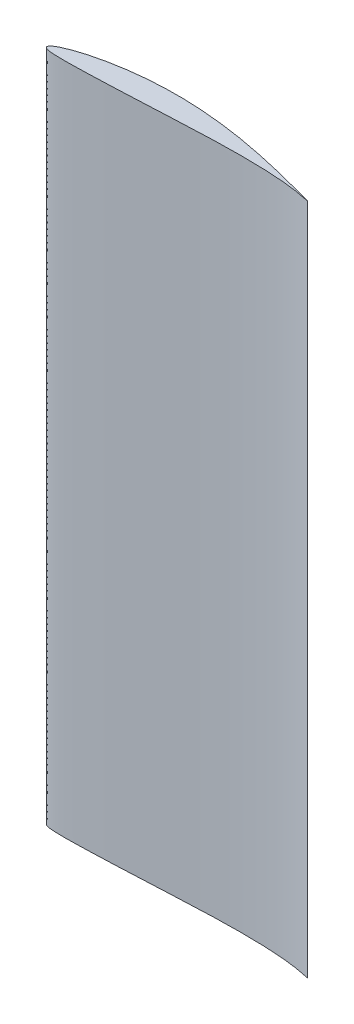
ISO-10303-21;
HEADER;
FILE_DESCRIPTION(('STEP AP214'),'2;1');
FILE_NAME('part.step','',(''),(''),'','','');
FILE_SCHEMA(('AUTOMOTIVE_DESIGN { 1 0 10303 214 1 1 1 1 }'));
ENDSEC;
DATA;
#1=APPLICATION_CONTEXT('core data for automotive mechanical design processes');
#2=APPLICATION_PROTOCOL_DEFINITION('international standard','automotive_design',2000,#1);
#3=PRODUCT_CONTEXT('',#1,'mechanical');
#4=PRODUCT('Part','Part','',(#3));
#5=PRODUCT_RELATED_PRODUCT_CATEGORY('part','',(#4));
#6=PRODUCT_DEFINITION_FORMATION('','',#4);
#7=PRODUCT_DEFINITION_CONTEXT('part definition',#1,'design');
#8=PRODUCT_DEFINITION('design','',#6,#7);
#9=PRODUCT_DEFINITION_SHAPE('','',#8);
#10=(LENGTH_UNIT() NAMED_UNIT(*) SI_UNIT(.MILLI.,.METRE.));
#11=(NAMED_UNIT(*) PLANE_ANGLE_UNIT() SI_UNIT($,.RADIAN.));
#12=(NAMED_UNIT(*) SI_UNIT($,.STERADIAN.) SOLID_ANGLE_UNIT());
#13=UNCERTAINTY_MEASURE_WITH_UNIT(LENGTH_MEASURE(1.E-05),#10,'distance_accuracy_value','');
#14=(GEOMETRIC_REPRESENTATION_CONTEXT(3) GLOBAL_UNCERTAINTY_ASSIGNED_CONTEXT((#13)) GLOBAL_UNIT_ASSIGNED_CONTEXT((#10,
#11,#12)) REPRESENTATION_CONTEXT('',''));
#15=CARTESIAN_POINT('',(0.,0.,0.));
#16=DIRECTION('',(0.,0.,1.));
#17=DIRECTION('',(1.,0.,0.));
#18=AXIS2_PLACEMENT_3D('',#15,#16,#17);
#19=CARTESIAN_POINT('',(-554.325552257857,0.,-56.8646156682797));
#20=DIRECTION('',(0.983760241532051,0.,-0.179487568318255));
#21=DIRECTION('',(-0.179487568318255,0.,-0.983760241532051));
#22=AXIS2_PLACEMENT_3D('',#19,#20,#21);
#23=PLANE('',#22);
#24=DIRECTION('',(0.,-1.,0.));
#25=VECTOR('',#24,1.);
#26=CARTESIAN_POINT('',(-528.575769962789,-239.8004537,84.2683459219282));
#27=LINE('',#26,#25);
#28=CARTESIAN_POINT('',(-528.575769939724,-253.210331383299,84.2683459272844));
#29=VERTEX_POINT('',#28);
#30=CARTESIAN_POINT('',(-528.575769944008,-507.210331383299,84.2683459262897));
#31=VERTEX_POINT('',#30);
#32=EDGE_CURVE('E44',#29,#31,#27,.T.);
#33=ORIENTED_EDGE('',*,*,#32,.T.);
#34=DIRECTION('',(-0.179487614062532,0.,-0.983760233185983));
#35=VECTOR('',#34,1.);
#36=CARTESIAN_POINT('',(-528.591918071853,-507.210331383299,84.1798390613565));
#37=LINE('',#36,#35);
#38=CARTESIAN_POINT('',(-528.591918071128,-507.210331383299,84.1798390653302));
#39=VERTEX_POINT('',#38);
#40=EDGE_CURVE('E69',#31,#39,#37,.T.);
#41=ORIENTED_EDGE('',*,*,#40,.T.);
#42=DIRECTION('',(0.,-1.,0.));
#43=VECTOR('',#42,1.);
#44=CARTESIAN_POINT('',(-528.591918083824,-239.8004537,84.1798390618738));
#45=LINE('',#44,#43);
#46=CARTESIAN_POINT('',(-528.591918062001,-253.210331383299,84.1798390678149));
#47=VERTEX_POINT('',#46);
#48=EDGE_CURVE('E11',#39,#47,#45,.F.);
#49=ORIENTED_EDGE('',*,*,#48,.T.);
#50=DIRECTION('',(0.17948756488624,0.,0.983760242158224));
#51=VECTOR('',#50,1.);
#52=CARTESIAN_POINT('',(-528.575769940641,-253.210331383299,84.2683459222606));
#53=LINE('',#52,#51);
#54=EDGE_CURVE('E68',#47,#29,#53,.T.);
#55=ORIENTED_EDGE('',*,*,#54,.T.);
#56=EDGE_LOOP('',(#33,#41,#49,#55));
#57=FACE_BOUND('',#56,.T.);
#58=ADVANCED_FACE('F34',(#57),#23,.T.);
#59=CARTESIAN_POINT('',(-526.593419765934,-239.8004537,84.7239199130439));
#60=CARTESIAN_POINT('',(-527.259585871897,-239.8004537,84.5425596293205));
#61=CARTESIAN_POINT('',(-527.92575197786,-239.8004537,84.3611993455972));
#62=CARTESIAN_POINT('',(-528.591918083824,-239.8004537,84.1798390618738));
#63=CARTESIAN_POINT('',(-530.497138216162,-239.8004537,83.6611527152356));
#64=CARTESIAN_POINT('',(-534.152374255812,-239.8004537,82.6762330634614));
#65=CARTESIAN_POINT('',(-539.982108342011,-239.8004537,81.1611509221717));
#66=CARTESIAN_POINT('',(-545.957453464546,-239.8004537,79.6969831396235));
#67=CARTESIAN_POINT('',(-551.162022478609,-239.8004537,78.5269223568208));
#68=CARTESIAN_POINT('',(-555.323842405048,-239.8004537,77.672019641801));
#69=CARTESIAN_POINT('',(-558.463490437311,-239.8004537,77.0704112611737));
#70=CARTESIAN_POINT('',(-561.59743117091,-239.8004537,76.5181057779595));
#71=CARTESIAN_POINT('',(-564.824208706987,-239.8004537,76.0021223648773));
#72=CARTESIAN_POINT('',(-568.119644878359,-239.8004537,75.5359523553538));
#73=CARTESIAN_POINT('',(-571.485057233212,-239.8004537,75.1275157973673));
#74=CARTESIAN_POINT('',(-574.868030500645,-239.8004537,74.7910791806653));
#75=CARTESIAN_POINT('',(-578.091795357308,-239.8004537,74.5395167140872));
#76=CARTESIAN_POINT('',(-581.160116557733,-239.8004537,74.3539017800194));
#77=CARTESIAN_POINT('',(-584.038090585231,-239.8004537,74.2365051093385));
#78=CARTESIAN_POINT('',(-586.914428291189,-239.8004537,74.1830869395487));
#79=CARTESIAN_POINT('',(-589.896558655677,-239.8004537,74.1923438209683));
#80=CARTESIAN_POINT('',(-592.983115789962,-239.8004537,74.2735758159778));
#81=CARTESIAN_POINT('',(-596.173451342689,-239.8004537,74.4396005836429));
#82=CARTESIAN_POINT('',(-599.355769517787,-239.8004537,74.6874159477797));
#83=CARTESIAN_POINT('',(-602.53411874826,-239.8004537,75.0169077766059));
#84=CARTESIAN_POINT('',(-605.17250746658,-239.8004537,75.3608845639358));
#85=CARTESIAN_POINT('',(-607.275094484379,-239.8004537,75.6787374805192));
#86=CARTESIAN_POINT('',(-608.844128267428,-239.8004537,75.9383218957363));
#87=CARTESIAN_POINT('',(-610.410125982362,-239.8004537,76.2200005207807));
#88=CARTESIAN_POINT('',(-611.97533572736,-239.8004537,76.525593801417));
#89=CARTESIAN_POINT('',(-613.538215781285,-239.8004537,76.8563798041714));
#90=CARTESIAN_POINT('',(-614.848329170269,-239.8004537,77.1563581609815));
#91=CARTESIAN_POINT('',(-615.918435733108,-239.8004537,77.4169575519566));
#92=CARTESIAN_POINT('',(-616.747067939194,-239.8004537,77.6276299376467));
#93=CARTESIAN_POINT('',(-617.576027468063,-239.8004537,77.8479257179723));
#94=CARTESIAN_POINT('',(-618.392498935893,-239.8004537,78.0747363302009));
#95=CARTESIAN_POINT('',(-619.205560354131,-239.8004537,78.3108188199684));
#96=CARTESIAN_POINT('',(-620.018568231687,-239.8004537,78.5579465251468));
#97=CARTESIAN_POINT('',(-620.835135260398,-239.8004537,78.8183863563189));
#98=CARTESIAN_POINT('',(-621.646830026876,-239.8004537,79.0900082378914));
#99=CARTESIAN_POINT('',(-622.453429478616,-239.8004537,79.3746820906908));
#100=CARTESIAN_POINT('',(-623.24662245888,-239.8004537,79.6727689487293));
#101=CARTESIAN_POINT('',(-624.031597033132,-239.8004537,79.9904026218772));
#102=CARTESIAN_POINT('',(-624.807385625176,-239.8004537,80.3299315239951));
#103=CARTESIAN_POINT('',(-625.460320993749,-239.8004537,80.6371839893424));
#104=CARTESIAN_POINT('',(-625.97600114632,-239.8004537,80.8927546987617));
#105=CARTESIAN_POINT('',(-626.360660841949,-239.8004537,81.091190440915));
#106=CARTESIAN_POINT('',(-626.725483770262,-239.8004537,81.2952421386952));
#107=CARTESIAN_POINT('',(-627.083800697779,-239.8004537,81.5178228833185));
#108=CARTESIAN_POINT('',(-627.427112918002,-239.8004537,81.7619737990763));
#109=CARTESIAN_POINT('',(-627.692990121658,-239.8004537,81.9797142422138));
#110=CARTESIAN_POINT('',(-627.886358398128,-239.8004537,82.1560417964073));
#111=CARTESIAN_POINT('',(-628.011436470284,-239.8004537,82.2908751384918));
#112=CARTESIAN_POINT('',(-628.119597649023,-239.8004537,82.4426834109219));
#113=CARTESIAN_POINT('',(-628.204110478089,-239.8004537,82.6132580652257));
#114=CARTESIAN_POINT('',(-628.259751808724,-239.8004537,82.7947292025837));
#115=CARTESIAN_POINT('',(-628.278589178469,-239.8004537,82.9788856652501));
#116=CARTESIAN_POINT('',(-628.247765545933,-239.8004537,83.1568231089226));
#117=CARTESIAN_POINT('',(-628.154955410665,-239.8004537,83.3092479690364));
#118=CARTESIAN_POINT('',(-628.024383448377,-239.8004537,83.4307744337206));
#119=CARTESIAN_POINT('',(-627.865452945988,-239.8004537,83.5355647646006));
#120=CARTESIAN_POINT('',(-627.696354385194,-239.8004537,83.6216033250483));
#121=CARTESIAN_POINT('',(-627.519605411,-239.8004537,83.6962227929075));
#122=CARTESIAN_POINT('',(-627.353308124164,-239.8004537,83.7544414252507));
#123=CARTESIAN_POINT('',(-627.129623365981,-239.8004537,83.8196992415909));
#124=CARTESIAN_POINT('',(-626.838241327886,-239.8004537,83.8866248908074));
#125=CARTESIAN_POINT('',(-626.48391065014,-239.8004537,83.9480474788163));
#126=CARTESIAN_POINT('',(-626.12047042601,-239.8004537,83.9984758883653));
#127=CARTESIAN_POINT('',(-625.769813360012,-239.8004537,84.0381264987704));
#128=CARTESIAN_POINT('',(-625.41504483594,-239.8004537,84.0705413531205));
#129=CARTESIAN_POINT('',(-625.05528087275,-239.8004537,84.0978236463921));
#130=CARTESIAN_POINT('',(-624.693918003881,-239.8004537,84.1213039879874));
#131=CARTESIAN_POINT('',(-624.331784051651,-239.8004537,84.1416706992703));
#132=CARTESIAN_POINT('',(-623.856159801903,-239.8004537,84.1647415786361));
#133=CARTESIAN_POINT('',(-623.274302103442,-239.8004537,84.1866861864042));
#134=CARTESIAN_POINT('',(-622.577740296122,-239.8004537,84.2052918928147));
#135=CARTESIAN_POINT('',(-621.876656831597,-239.8004537,84.2177202128941));
#136=CARTESIAN_POINT('',(-621.13791086145,-239.8004537,84.2247931924304));
#137=CARTESIAN_POINT('',(-620.40839665173,-239.8004537,84.2264613573671));
#138=CARTESIAN_POINT('',(-619.698179134347,-239.8004537,84.2237213151792));
#139=CARTESIAN_POINT('',(-619.005405670084,-239.8004537,84.2176740611081));
#140=CARTESIAN_POINT('',(-618.252758564704,-239.8004537,84.20800235929));
#141=CARTESIAN_POINT('',(-617.467883394032,-239.8004537,84.1948751875934));
#142=CARTESIAN_POINT('',(-616.433921687155,-239.8004537,84.1741070232226));
#143=CARTESIAN_POINT('',(-615.142982081053,-239.8004537,84.1434590507468));
#144=CARTESIAN_POINT('',(-613.53006742117,-239.8004537,84.0992189587972));
#145=CARTESIAN_POINT('',(-611.888435911326,-239.8004537,84.0492301393403));
#146=CARTESIAN_POINT('',(-610.247930028029,-239.8004537,83.9954407304926));
#147=CARTESIAN_POINT('',(-608.676663506592,-239.8004537,83.940785594189));
#148=CARTESIAN_POINT('',(-607.091848772311,-239.8004537,83.8828023631351));
#149=CARTESIAN_POINT('',(-605.486202295219,-239.8004537,83.8216893753504));
#150=CARTESIAN_POINT('',(-603.850136042464,-239.8004537,83.757431508272));
#151=CARTESIAN_POINT('',(-602.212495016589,-239.8004537,83.6918374700966));
#152=CARTESIAN_POINT('',(-600.609672727076,-239.8004537,83.6264393414571));
#153=CARTESIAN_POINT('',(-599.031142280928,-239.8004537,83.5606843189151));
#154=CARTESIAN_POINT('',(-597.444138588479,-239.8004537,83.4934060650845));
#155=CARTESIAN_POINT('',(-595.324681026734,-239.8004537,83.4013499055013));
#156=CARTESIAN_POINT('',(-592.7462925839,-239.8004537,83.2852253347514));
#157=CARTESIAN_POINT('',(-589.473300422514,-239.8004537,83.1281542870365));
#158=CARTESIAN_POINT('',(-586.042648232423,-239.8004537,82.9582761960707));
#159=CARTESIAN_POINT('',(-582.490586502904,-239.8004537,82.7804369677617));
#160=CARTESIAN_POINT('',(-579.182904017143,-239.8004537,82.6181104834192));
#161=CARTESIAN_POINT('',(-576.155602563079,-239.8004537,82.4762526895564));
#162=CARTESIAN_POINT('',(-573.252760019019,-239.8004537,82.3480656154033));
#163=CARTESIAN_POINT('',(-570.429258729535,-239.8004537,82.2309145877562));
#164=CARTESIAN_POINT('',(-567.459339431622,-239.8004537,82.1313636656623));
#165=CARTESIAN_POINT('',(-564.850547994564,-239.8004537,82.0685637584189));
#166=CARTESIAN_POINT('',(-562.692490355915,-239.8004537,82.0174720350613));
#167=CARTESIAN_POINT('',(-560.554619151564,-239.8004537,81.9674534703154));
#168=CARTESIAN_POINT('',(-557.983569299121,-239.8004537,81.9219521096185));
#169=CARTESIAN_POINT('',(-554.794919072768,-239.8004537,81.9156396553184));
#170=CARTESIAN_POINT('',(-551.610605722812,-239.8004537,81.9488257047568));
#171=CARTESIAN_POINT('',(-548.414463715892,-239.8004537,82.024614191168));
#172=CARTESIAN_POINT('',(-545.228115384306,-239.8004537,82.1538046890369));
#173=CARTESIAN_POINT('',(-541.968572902875,-239.8004537,82.3421818495446));
#174=CARTESIAN_POINT('',(-538.64428134478,-239.8004537,82.6126797603633));
#175=CARTESIAN_POINT('',(-535.252866283238,-239.8004537,83.0153913105818));
#176=CARTESIAN_POINT('',(-531.897478264769,-239.8004537,83.5533883576312));
#177=CARTESIAN_POINT('',(-529.665252248977,-239.8004537,84.0153420380267));
#178=CARTESIAN_POINT('',(-528.575769962789,-239.8004537,84.2683459219282));
#179=CARTESIAN_POINT('',(-527.919682592478,-239.8004537,84.4207051249843));
#180=CARTESIAN_POINT('',(-527.263595222166,-239.8004537,84.5730643280405));
#181=CARTESIAN_POINT('',(-526.607507851856,-239.8004537,84.7254235310966));
#182=(BOUNDED_CURVE() B_SPLINE_CURVE(3,(#59,#60,#61,#62,#63,#64,#65,#66,#67,#68,#69,#70,#71,#72,
#73,#74,#75,#76,#77,#78,#79,#80,#81,#82,#83,#84,#85,#86,#87,#88,#89,#90,#91,#92,#93,#94,#95,#96,
#97,#98,#99,#100,#101,#102,#103,#104,#105,#106,#107,#108,#109,#110,#111,#112,#113,#114,#115,
#116,#117,#118,#119,#120,#121,#122,#123,#124,#125,#126,#127,#128,#129,#130,#131,#132,#133,#134,
#135,#136,#137,#138,#139,#140,#141,#142,#143,#144,#145,#146,#147,#148,#149,#150,#151,#152,#153,
#154,#155,#156,#157,#158,#159,#160,#161,#162,#163,#164,#165,#166,#167,#168,#169,#170,#171,#172,
#173,#174,#175,#176,#177,#178,#179,#180,#181),.UNSPECIFIED.,.F.,
.F.) B_SPLINE_CURVE_WITH_KNOTS((4,3,1,1,1,1,1,1,1,1,1,1,1,1,1,1,1,1,1,1,1,1,1,1,1,1,1,1,1,1,1,1,
1,1,1,1,1,1,1,1,1,1,1,1,1,1,1,1,1,1,1,1,1,1,1,1,1,1,1,1,1,1,1,1,1,1,1,1,1,1,1,1,1,1,1,1,1,1,1,1,
1,1,1,1,1,1,1,1,1,1,1,1,1,1,1,1,1,1,1,1,1,1,1,1,1,1,1,1,1,1,1,1,1,1,1,3,4),(-2.028102131,0.,
5.800326639,11.56708317,17.94238355,24.32803371,27.53215933,30.70773874,33.91000701,37.08447162,
40.50895139,43.8966956,47.25440821,50.70870113,53.59759749,56.47686852,59.35004175,62.22840997,
65.42361909,68.61305581,71.81246022,74.99958755,78.19930814,79.79462809,81.37946996,82.97073005,
84.5683458,86.16406893,87.76353673,88.60062982,89.46848312,90.32872771,91.17402976,92.01085118,
92.86885261,93.72342657,94.58231837,95.43682984,96.28965307,97.12445389,97.9772516,98.83013521,
99.28930627,99.70399764,100.1286373,100.5432242,100.9690963,101.3918568,101.573689,101.7540123,
101.9428712,102.1312819,102.3234027,102.5099534,102.6837085,102.8568762,103.0370367,103.2162328,
103.4267447,103.6056681,103.7916159,103.9550953,104.3045948,104.688086,105.0338202,105.4053535,
105.74679,106.1026115,106.487829,106.8332534,107.1908268,107.9165023,108.5801971,109.2814335,
110.0202634,110.7967311,111.4701767,112.151127,112.8753234,113.7285151,114.5063016,115.978126,
117.6027853,119.3473198,120.9057675,122.5274142,124.0644169,125.6638443,127.3482992,128.9768668,
130.5811748,132.1612244,133.7170165,135.3469141,138.5261993,141.4607499,145.1781208,148.8317471,
152.1312963,155.114057,157.9244682,160.8491443,163.5926218,166.83998,168.6784709,170.0692474,
173.2559492,176.3934516,179.6357028,182.8104371,185.9847036,189.204042,192.6042447,195.9935227,
199.4423974,202.8102131,204.838315231),
.UNSPECIFIED.) CURVE() GEOMETRIC_REPRESENTATION_ITEM() RATIONAL_B_SPLINE_CURVE((1.,1.,1.,1.,1.,
1.,1.,1.,1.,1.,1.,1.,1.,1.,1.,1.,1.,1.,1.,1.,1.,1.,1.,1.,1.,1.,1.,1.,1.,1.,1.,1.,1.,1.,1.,1.,1.,
1.,1.,1.,1.,1.,1.,1.,1.,1.,1.,1.,1.,1.,1.,1.,1.,1.,1.,1.,1.,1.,1.,1.,1.,1.,1.,1.,1.,1.,1.,1.,1.,
1.,1.,1.,1.,1.,1.,1.,1.,1.,1.,1.,1.,1.,1.,1.,1.,1.,1.,1.,1.,1.,1.,1.,1.,1.,1.,1.,1.,1.,1.,1.,1.,
1.,1.,1.,1.,1.,1.,1.,1.,1.,1.,1.,1.,1.,1.,1.,1.,1.,1.,1.,1.,1.,1.)) REPRESENTATION_ITEM(''));
#183=DIRECTION('',(0.,-1.,0.));
#184=VECTOR('',#183,1.);
#185=SURFACE_OF_LINEAR_EXTRUSION('',#182,#184);
#186=ORIENTED_EDGE('',*,*,#32,.F.);
#187=CARTESIAN_POINT('',(-526.593419765934,-253.210331383304,84.7239199130439));
#188=CARTESIAN_POINT('',(-527.259585871897,-253.210331383304,84.5425596293205));
#189=CARTESIAN_POINT('',(-527.92575197786,-253.210331383304,84.3611993455972));
#190=CARTESIAN_POINT('',(-528.591918083824,-253.210331383304,84.1798390618738));
#191=CARTESIAN_POINT('',(-530.497138216162,-253.210331383304,83.6611527152356));
#192=CARTESIAN_POINT('',(-534.152374255812,-253.210331383304,82.6762330634614));
#193=CARTESIAN_POINT('',(-539.982108342011,-253.210331383304,81.1611509221717));
#194=CARTESIAN_POINT('',(-545.957453464546,-253.210331383304,79.6969831396235));
#195=CARTESIAN_POINT('',(-551.162022478609,-253.210331383304,78.5269223568208));
#196=CARTESIAN_POINT('',(-555.323842405048,-253.210331383304,77.672019641801));
#197=CARTESIAN_POINT('',(-558.463490437311,-253.210331383304,77.0704112611737));
#198=CARTESIAN_POINT('',(-561.59743117091,-253.210331383304,76.5181057779595));
#199=CARTESIAN_POINT('',(-564.824208706987,-253.210331383304,76.0021223648773));
#200=CARTESIAN_POINT('',(-568.119644878359,-253.210331383304,75.5359523553538));
#201=CARTESIAN_POINT('',(-571.485057233212,-253.210331383304,75.1275157973673));
#202=CARTESIAN_POINT('',(-574.868030500645,-253.210331383304,74.7910791806653));
#203=CARTESIAN_POINT('',(-578.091795357308,-253.210331383304,74.5395167140872));
#204=CARTESIAN_POINT('',(-581.160116557733,-253.210331383304,74.3539017800194));
#205=CARTESIAN_POINT('',(-584.038090585231,-253.210331383304,74.2365051093385));
#206=CARTESIAN_POINT('',(-586.914428291189,-253.210331383304,74.1830869395487));
#207=CARTESIAN_POINT('',(-589.896558655677,-253.210331383304,74.1923438209683));
#208=CARTESIAN_POINT('',(-592.983115789962,-253.210331383304,74.2735758159778));
#209=CARTESIAN_POINT('',(-596.173451342689,-253.210331383304,74.4396005836429));
#210=CARTESIAN_POINT('',(-599.355769517787,-253.210331383304,74.6874159477797));
#211=CARTESIAN_POINT('',(-602.53411874826,-253.210331383304,75.0169077766059));
#212=CARTESIAN_POINT('',(-605.17250746658,-253.210331383304,75.3608845639358));
#213=CARTESIAN_POINT('',(-607.275094484379,-253.210331383304,75.6787374805192));
#214=CARTESIAN_POINT('',(-608.844128267428,-253.210331383304,75.9383218957363));
#215=CARTESIAN_POINT('',(-610.410125982362,-253.210331383304,76.2200005207807));
#216=CARTESIAN_POINT('',(-611.97533572736,-253.210331383304,76.525593801417));
#217=CARTESIAN_POINT('',(-613.538215781285,-253.210331383304,76.8563798041714));
#218=CARTESIAN_POINT('',(-614.848329170269,-253.210331383304,77.1563581609815));
#219=CARTESIAN_POINT('',(-615.918435733108,-253.210331383304,77.4169575519566));
#220=CARTESIAN_POINT('',(-616.747067939194,-253.210331383304,77.6276299376467));
#221=CARTESIAN_POINT('',(-617.576027468063,-253.210331383304,77.8479257179723));
#222=CARTESIAN_POINT('',(-618.392498935893,-253.210331383304,78.0747363302009));
#223=CARTESIAN_POINT('',(-619.205560354131,-253.210331383304,78.3108188199684));
#224=CARTESIAN_POINT('',(-620.018568231687,-253.210331383304,78.5579465251468));
#225=CARTESIAN_POINT('',(-620.835135260398,-253.210331383304,78.8183863563189));
#226=CARTESIAN_POINT('',(-621.646830026876,-253.210331383304,79.0900082378914));
#227=CARTESIAN_POINT('',(-622.453429478616,-253.210331383304,79.3746820906908));
#228=CARTESIAN_POINT('',(-623.24662245888,-253.210331383304,79.6727689487293));
#229=CARTESIAN_POINT('',(-624.031597033132,-253.210331383304,79.9904026218772));
#230=CARTESIAN_POINT('',(-624.807385625176,-253.210331383304,80.3299315239951));
#231=CARTESIAN_POINT('',(-625.460320993749,-253.210331383304,80.6371839893424));
#232=CARTESIAN_POINT('',(-625.97600114632,-253.210331383304,80.8927546987617));
#233=CARTESIAN_POINT('',(-626.360660841949,-253.210331383304,81.091190440915));
#234=CARTESIAN_POINT('',(-626.725483770262,-253.210331383304,81.2952421386952));
#235=CARTESIAN_POINT('',(-627.083800697779,-253.210331383304,81.5178228833185));
#236=CARTESIAN_POINT('',(-627.427112918002,-253.210331383304,81.7619737990763));
#237=CARTESIAN_POINT('',(-627.692990121658,-253.210331383304,81.9797142422138));
#238=CARTESIAN_POINT('',(-627.886358398128,-253.210331383304,82.1560417964073));
#239=CARTESIAN_POINT('',(-628.011436470284,-253.210331383304,82.2908751384918));
#240=CARTESIAN_POINT('',(-628.119597649023,-253.210331383304,82.4426834109219));
#241=CARTESIAN_POINT('',(-628.204110478089,-253.210331383304,82.6132580652257));
#242=CARTESIAN_POINT('',(-628.259751808724,-253.210331383304,82.7947292025837));
#243=CARTESIAN_POINT('',(-628.278589178469,-253.210331383304,82.9788856652501));
#244=CARTESIAN_POINT('',(-628.247765545933,-253.210331383304,83.1568231089226));
#245=CARTESIAN_POINT('',(-628.154955410665,-253.210331383304,83.3092479690364));
#246=CARTESIAN_POINT('',(-628.024383448377,-253.210331383304,83.4307744337206));
#247=CARTESIAN_POINT('',(-627.865452945988,-253.210331383304,83.5355647646006));
#248=CARTESIAN_POINT('',(-627.696354385194,-253.210331383304,83.6216033250483));
#249=CARTESIAN_POINT('',(-627.519605411,-253.210331383304,83.6962227929075));
#250=CARTESIAN_POINT('',(-627.353308124164,-253.210331383304,83.7544414252507));
#251=CARTESIAN_POINT('',(-627.129623365981,-253.210331383304,83.8196992415909));
#252=CARTESIAN_POINT('',(-626.838241327886,-253.210331383304,83.8866248908074));
#253=CARTESIAN_POINT('',(-626.48391065014,-253.210331383304,83.9480474788163));
#254=CARTESIAN_POINT('',(-626.12047042601,-253.210331383304,83.9984758883653));
#255=CARTESIAN_POINT('',(-625.769813360012,-253.210331383304,84.0381264987704));
#256=CARTESIAN_POINT('',(-625.41504483594,-253.210331383304,84.0705413531205));
#257=CARTESIAN_POINT('',(-625.05528087275,-253.210331383304,84.0978236463921));
#258=CARTESIAN_POINT('',(-624.693918003881,-253.210331383304,84.1213039879874));
#259=CARTESIAN_POINT('',(-624.331784051651,-253.210331383304,84.1416706992703));
#260=CARTESIAN_POINT('',(-623.856159801903,-253.210331383304,84.1647415786361));
#261=CARTESIAN_POINT('',(-623.274302103442,-253.210331383304,84.1866861864042));
#262=CARTESIAN_POINT('',(-622.577740296122,-253.210331383304,84.2052918928147));
#263=CARTESIAN_POINT('',(-621.876656831597,-253.210331383304,84.2177202128941));
#264=CARTESIAN_POINT('',(-621.13791086145,-253.210331383304,84.2247931924304));
#265=CARTESIAN_POINT('',(-620.40839665173,-253.210331383304,84.2264613573671));
#266=CARTESIAN_POINT('',(-619.698179134347,-253.210331383304,84.2237213151792));
#267=CARTESIAN_POINT('',(-619.005405670084,-253.210331383304,84.2176740611081));
#268=CARTESIAN_POINT('',(-618.252758564704,-253.210331383304,84.20800235929));
#269=CARTESIAN_POINT('',(-617.467883394032,-253.210331383304,84.1948751875934));
#270=CARTESIAN_POINT('',(-616.433921687155,-253.210331383304,84.1741070232226));
#271=CARTESIAN_POINT('',(-615.142982081053,-253.210331383304,84.1434590507468));
#272=CARTESIAN_POINT('',(-613.53006742117,-253.210331383304,84.0992189587972));
#273=CARTESIAN_POINT('',(-611.888435911326,-253.210331383304,84.0492301393403));
#274=CARTESIAN_POINT('',(-610.247930028029,-253.210331383304,83.9954407304926));
#275=CARTESIAN_POINT('',(-608.676663506592,-253.210331383304,83.940785594189));
#276=CARTESIAN_POINT('',(-607.091848772311,-253.210331383304,83.8828023631351));
#277=CARTESIAN_POINT('',(-605.486202295219,-253.210331383304,83.8216893753504));
#278=CARTESIAN_POINT('',(-603.850136042464,-253.210331383304,83.757431508272));
#279=CARTESIAN_POINT('',(-602.212495016589,-253.210331383304,83.6918374700966));
#280=CARTESIAN_POINT('',(-600.609672727076,-253.210331383304,83.6264393414571));
#281=CARTESIAN_POINT('',(-599.031142280928,-253.210331383304,83.5606843189151));
#282=CARTESIAN_POINT('',(-597.444138588479,-253.210331383304,83.4934060650845));
#283=CARTESIAN_POINT('',(-595.324681026734,-253.210331383304,83.4013499055013));
#284=CARTESIAN_POINT('',(-592.7462925839,-253.210331383304,83.2852253347514));
#285=CARTESIAN_POINT('',(-589.473300422514,-253.210331383304,83.1281542870365));
#286=CARTESIAN_POINT('',(-586.042648232423,-253.210331383304,82.9582761960707));
#287=CARTESIAN_POINT('',(-582.490586502904,-253.210331383304,82.7804369677617));
#288=CARTESIAN_POINT('',(-579.182904017143,-253.210331383304,82.6181104834192));
#289=CARTESIAN_POINT('',(-576.155602563079,-253.210331383304,82.4762526895564));
#290=CARTESIAN_POINT('',(-573.252760019019,-253.210331383304,82.3480656154033));
#291=CARTESIAN_POINT('',(-570.429258729535,-253.210331383304,82.2309145877562));
#292=CARTESIAN_POINT('',(-567.459339431622,-253.210331383304,82.1313636656623));
#293=CARTESIAN_POINT('',(-564.850547994564,-253.210331383304,82.0685637584189));
#294=CARTESIAN_POINT('',(-562.692490355915,-253.210331383304,82.0174720350613));
#295=CARTESIAN_POINT('',(-560.554619151564,-253.210331383304,81.9674534703154));
#296=CARTESIAN_POINT('',(-557.983569299121,-253.210331383304,81.9219521096185));
#297=CARTESIAN_POINT('',(-554.794919072768,-253.210331383304,81.9156396553184));
#298=CARTESIAN_POINT('',(-551.610605722812,-253.210331383304,81.9488257047568));
#299=CARTESIAN_POINT('',(-548.414463715892,-253.210331383304,82.024614191168));
#300=CARTESIAN_POINT('',(-545.228115384306,-253.210331383304,82.1538046890369));
#301=CARTESIAN_POINT('',(-541.968572902875,-253.210331383304,82.3421818495446));
#302=CARTESIAN_POINT('',(-538.64428134478,-253.210331383304,82.6126797603633));
#303=CARTESIAN_POINT('',(-535.252866283238,-253.210331383304,83.0153913105818));
#304=CARTESIAN_POINT('',(-531.897478264769,-253.210331383304,83.5533883576312));
#305=CARTESIAN_POINT('',(-529.665252248977,-253.210331383304,84.0153420380267));
#306=CARTESIAN_POINT('',(-528.575769962789,-253.210331383304,84.2683459219282));
#307=CARTESIAN_POINT('',(-527.919682592478,-253.210331383304,84.4207051249843));
#308=CARTESIAN_POINT('',(-527.263595222166,-253.210331383304,84.5730643280405));
#309=CARTESIAN_POINT('',(-526.607507851856,-253.210331383304,84.7254235310966));
#310=(BOUNDED_CURVE() B_SPLINE_CURVE(3,(#187,#188,#189,#190,#191,#192,#193,#194,#195,#196,#197,
#198,#199,#200,#201,#202,#203,#204,#205,#206,#207,#208,#209,#210,#211,#212,#213,#214,#215,#216,
#217,#218,#219,#220,#221,#222,#223,#224,#225,#226,#227,#228,#229,#230,#231,#232,#233,#234,#235,
#236,#237,#238,#239,#240,#241,#242,#243,#244,#245,#246,#247,#248,#249,#250,#251,#252,#253,#254,
#255,#256,#257,#258,#259,#260,#261,#262,#263,#264,#265,#266,#267,#268,#269,#270,#271,#272,#273,
#274,#275,#276,#277,#278,#279,#280,#281,#282,#283,#284,#285,#286,#287,#288,#289,#290,#291,#292,
#293,#294,#295,#296,#297,#298,#299,#300,#301,#302,#303,#304,#305,#306,#307,#308,#309),
.UNSPECIFIED.,.F.,.F.) B_SPLINE_CURVE_WITH_KNOTS((4,3,1,1,1,1,1,1,1,1,1,1,1,1,1,1,1,1,1,1,1,1,1,
1,1,1,1,1,1,1,1,1,1,1,1,1,1,1,1,1,1,1,1,1,1,1,1,1,1,1,1,1,1,1,1,1,1,1,1,1,1,1,1,1,1,1,1,1,1,1,1,
1,1,1,1,1,1,1,1,1,1,1,1,1,1,1,1,1,1,1,1,1,1,1,1,1,1,1,1,1,1,1,1,1,1,1,1,1,1,1,1,1,1,1,1,3,4),
(-2.028102131,0.,5.800326639,11.56708317,17.94238355,24.32803371,27.53215933,30.70773874,
33.91000701,37.08447162,40.50895139,43.8966956,47.25440821,50.70870113,53.59759749,56.47686852,
59.35004175,62.22840997,65.42361909,68.61305581,71.81246022,74.99958755,78.19930814,79.79462809,
81.37946996,82.97073005,84.5683458,86.16406893,87.76353673,88.60062982,89.46848312,90.32872771,
91.17402976,92.01085118,92.86885261,93.72342657,94.58231837,95.43682984,96.28965307,97.12445389,
97.9772516,98.83013521,99.28930627,99.70399764,100.1286373,100.5432242,100.9690963,101.3918568,
101.573689,101.7540123,101.9428712,102.1312819,102.3234027,102.5099534,102.6837085,102.8568762,
103.0370367,103.2162328,103.4267447,103.6056681,103.7916159,103.9550953,104.3045948,104.688086,
105.0338202,105.4053535,105.74679,106.1026115,106.487829,106.8332534,107.1908268,107.9165023,
108.5801971,109.2814335,110.0202634,110.7967311,111.4701767,112.151127,112.8753234,113.7285151,
114.5063016,115.978126,117.6027853,119.3473198,120.9057675,122.5274142,124.0644169,125.6638443,
127.3482992,128.9768668,130.5811748,132.1612244,133.7170165,135.3469141,138.5261993,141.4607499,
145.1781208,148.8317471,152.1312963,155.114057,157.9244682,160.8491443,163.5926218,166.83998,
168.6784709,170.0692474,173.2559492,176.3934516,179.6357028,182.8104371,185.9847036,189.204042,
192.6042447,195.9935227,199.4423974,202.8102131,204.838315231),
.UNSPECIFIED.) CURVE() GEOMETRIC_REPRESENTATION_ITEM() RATIONAL_B_SPLINE_CURVE((1.,1.,1.,1.,1.,
1.,1.,1.,1.,1.,1.,1.,1.,1.,1.,1.,1.,1.,1.,1.,1.,1.,1.,1.,1.,1.,1.,1.,1.,1.,1.,1.,1.,1.,1.,1.,1.,
1.,1.,1.,1.,1.,1.,1.,1.,1.,1.,1.,1.,1.,1.,1.,1.,1.,1.,1.,1.,1.,1.,1.,1.,1.,1.,1.,1.,1.,1.,1.,1.,
1.,1.,1.,1.,1.,1.,1.,1.,1.,1.,1.,1.,1.,1.,1.,1.,1.,1.,1.,1.,1.,1.,1.,1.,1.,1.,1.,1.,1.,1.,1.,1.,
1.,1.,1.,1.,1.,1.,1.,1.,1.,1.,1.,1.,1.,1.,1.,1.,1.,1.,1.,1.,1.,1.)) REPRESENTATION_ITEM(''));
#311=EDGE_CURVE('E62',#29,#47,#310,.F.);
#312=ORIENTED_EDGE('',*,*,#311,.T.);
#313=ORIENTED_EDGE('',*,*,#48,.F.);
#314=CARTESIAN_POINT('',(-526.593419765934,-507.210331383304,84.7239199130439));
#315=CARTESIAN_POINT('',(-527.259585871897,-507.210331383304,84.5425596293205));
#316=CARTESIAN_POINT('',(-527.92575197786,-507.210331383304,84.3611993455972));
#317=CARTESIAN_POINT('',(-528.591918083824,-507.210331383304,84.1798390618738));
#318=CARTESIAN_POINT('',(-530.497138216162,-507.210331383304,83.6611527152356));
#319=CARTESIAN_POINT('',(-534.152374255812,-507.210331383304,82.6762330634614));
#320=CARTESIAN_POINT('',(-539.982108342011,-507.210331383304,81.1611509221717));
#321=CARTESIAN_POINT('',(-545.957453464546,-507.210331383304,79.6969831396235));
#322=CARTESIAN_POINT('',(-551.162022478609,-507.210331383304,78.5269223568208));
#323=CARTESIAN_POINT('',(-555.323842405048,-507.210331383304,77.672019641801));
#324=CARTESIAN_POINT('',(-558.463490437311,-507.210331383304,77.0704112611737));
#325=CARTESIAN_POINT('',(-561.59743117091,-507.210331383304,76.5181057779595));
#326=CARTESIAN_POINT('',(-564.824208706987,-507.210331383304,76.0021223648773));
#327=CARTESIAN_POINT('',(-568.119644878359,-507.210331383304,75.5359523553538));
#328=CARTESIAN_POINT('',(-571.485057233212,-507.210331383304,75.1275157973673));
#329=CARTESIAN_POINT('',(-574.868030500645,-507.210331383304,74.7910791806653));
#330=CARTESIAN_POINT('',(-578.091795357308,-507.210331383304,74.5395167140872));
#331=CARTESIAN_POINT('',(-581.160116557733,-507.210331383304,74.3539017800194));
#332=CARTESIAN_POINT('',(-584.038090585231,-507.210331383304,74.2365051093385));
#333=CARTESIAN_POINT('',(-586.914428291189,-507.210331383304,74.1830869395487));
#334=CARTESIAN_POINT('',(-589.896558655677,-507.210331383304,74.1923438209683));
#335=CARTESIAN_POINT('',(-592.983115789962,-507.210331383304,74.2735758159778));
#336=CARTESIAN_POINT('',(-596.173451342689,-507.210331383304,74.4396005836429));
#337=CARTESIAN_POINT('',(-599.355769517787,-507.210331383304,74.6874159477797));
#338=CARTESIAN_POINT('',(-602.53411874826,-507.210331383304,75.0169077766059));
#339=CARTESIAN_POINT('',(-605.17250746658,-507.210331383304,75.3608845639358));
#340=CARTESIAN_POINT('',(-607.275094484379,-507.210331383304,75.6787374805192));
#341=CARTESIAN_POINT('',(-608.844128267428,-507.210331383304,75.9383218957363));
#342=CARTESIAN_POINT('',(-610.410125982362,-507.210331383304,76.2200005207807));
#343=CARTESIAN_POINT('',(-611.97533572736,-507.210331383304,76.525593801417));
#344=CARTESIAN_POINT('',(-613.538215781285,-507.210331383304,76.8563798041714));
#345=CARTESIAN_POINT('',(-614.848329170269,-507.210331383304,77.1563581609815));
#346=CARTESIAN_POINT('',(-615.918435733108,-507.210331383304,77.4169575519566));
#347=CARTESIAN_POINT('',(-616.747067939194,-507.210331383304,77.6276299376467));
#348=CARTESIAN_POINT('',(-617.576027468063,-507.210331383304,77.8479257179723));
#349=CARTESIAN_POINT('',(-618.392498935893,-507.210331383304,78.0747363302009));
#350=CARTESIAN_POINT('',(-619.205560354131,-507.210331383304,78.3108188199684));
#351=CARTESIAN_POINT('',(-620.018568231687,-507.210331383304,78.5579465251468));
#352=CARTESIAN_POINT('',(-620.835135260398,-507.210331383304,78.8183863563189));
#353=CARTESIAN_POINT('',(-621.646830026876,-507.210331383304,79.0900082378914));
#354=CARTESIAN_POINT('',(-622.453429478616,-507.210331383304,79.3746820906908));
#355=CARTESIAN_POINT('',(-623.24662245888,-507.210331383304,79.6727689487293));
#356=CARTESIAN_POINT('',(-624.031597033132,-507.210331383304,79.9904026218772));
#357=CARTESIAN_POINT('',(-624.807385625176,-507.210331383304,80.3299315239951));
#358=CARTESIAN_POINT('',(-625.460320993749,-507.210331383304,80.6371839893424));
#359=CARTESIAN_POINT('',(-625.97600114632,-507.210331383304,80.8927546987617));
#360=CARTESIAN_POINT('',(-626.360660841949,-507.210331383304,81.091190440915));
#361=CARTESIAN_POINT('',(-626.725483770262,-507.210331383304,81.2952421386952));
#362=CARTESIAN_POINT('',(-627.083800697779,-507.210331383304,81.5178228833185));
#363=CARTESIAN_POINT('',(-627.427112918002,-507.210331383304,81.7619737990763));
#364=CARTESIAN_POINT('',(-627.692990121658,-507.210331383304,81.9797142422138));
#365=CARTESIAN_POINT('',(-627.886358398128,-507.210331383304,82.1560417964073));
#366=CARTESIAN_POINT('',(-628.011436470284,-507.210331383304,82.2908751384918));
#367=CARTESIAN_POINT('',(-628.119597649023,-507.210331383304,82.4426834109219));
#368=CARTESIAN_POINT('',(-628.204110478089,-507.210331383304,82.6132580652257));
#369=CARTESIAN_POINT('',(-628.259751808724,-507.210331383304,82.7947292025837));
#370=CARTESIAN_POINT('',(-628.278589178469,-507.210331383304,82.9788856652501));
#371=CARTESIAN_POINT('',(-628.247765545933,-507.210331383304,83.1568231089226));
#372=CARTESIAN_POINT('',(-628.154955410665,-507.210331383304,83.3092479690364));
#373=CARTESIAN_POINT('',(-628.024383448377,-507.210331383304,83.4307744337206));
#374=CARTESIAN_POINT('',(-627.865452945988,-507.210331383304,83.5355647646006));
#375=CARTESIAN_POINT('',(-627.696354385194,-507.210331383304,83.6216033250483));
#376=CARTESIAN_POINT('',(-627.519605411,-507.210331383304,83.6962227929075));
#377=CARTESIAN_POINT('',(-627.353308124164,-507.210331383304,83.7544414252507));
#378=CARTESIAN_POINT('',(-627.129623365981,-507.210331383304,83.8196992415909));
#379=CARTESIAN_POINT('',(-626.838241327886,-507.210331383304,83.8866248908074));
#380=CARTESIAN_POINT('',(-626.48391065014,-507.210331383304,83.9480474788163));
#381=CARTESIAN_POINT('',(-626.12047042601,-507.210331383304,83.9984758883653));
#382=CARTESIAN_POINT('',(-625.769813360012,-507.210331383304,84.0381264987704));
#383=CARTESIAN_POINT('',(-625.41504483594,-507.210331383304,84.0705413531205));
#384=CARTESIAN_POINT('',(-625.05528087275,-507.210331383304,84.0978236463921));
#385=CARTESIAN_POINT('',(-624.693918003881,-507.210331383304,84.1213039879874));
#386=CARTESIAN_POINT('',(-624.331784051651,-507.210331383304,84.1416706992703));
#387=CARTESIAN_POINT('',(-623.856159801903,-507.210331383304,84.1647415786361));
#388=CARTESIAN_POINT('',(-623.274302103442,-507.210331383304,84.1866861864042));
#389=CARTESIAN_POINT('',(-622.577740296122,-507.210331383304,84.2052918928147));
#390=CARTESIAN_POINT('',(-621.876656831597,-507.210331383304,84.2177202128941));
#391=CARTESIAN_POINT('',(-621.13791086145,-507.210331383304,84.2247931924304));
#392=CARTESIAN_POINT('',(-620.40839665173,-507.210331383304,84.2264613573671));
#393=CARTESIAN_POINT('',(-619.698179134347,-507.210331383304,84.2237213151792));
#394=CARTESIAN_POINT('',(-619.005405670084,-507.210331383304,84.2176740611081));
#395=CARTESIAN_POINT('',(-618.252758564704,-507.210331383304,84.20800235929));
#396=CARTESIAN_POINT('',(-617.467883394032,-507.210331383304,84.1948751875934));
#397=CARTESIAN_POINT('',(-616.433921687155,-507.210331383304,84.1741070232226));
#398=CARTESIAN_POINT('',(-615.142982081053,-507.210331383304,84.1434590507468));
#399=CARTESIAN_POINT('',(-613.53006742117,-507.210331383304,84.0992189587972));
#400=CARTESIAN_POINT('',(-611.888435911326,-507.210331383304,84.0492301393403));
#401=CARTESIAN_POINT('',(-610.247930028029,-507.210331383304,83.9954407304926));
#402=CARTESIAN_POINT('',(-608.676663506592,-507.210331383304,83.940785594189));
#403=CARTESIAN_POINT('',(-607.091848772311,-507.210331383304,83.8828023631351));
#404=CARTESIAN_POINT('',(-605.486202295219,-507.210331383304,83.8216893753504));
#405=CARTESIAN_POINT('',(-603.850136042464,-507.210331383304,83.757431508272));
#406=CARTESIAN_POINT('',(-602.212495016589,-507.210331383304,83.6918374700966));
#407=CARTESIAN_POINT('',(-600.609672727076,-507.210331383304,83.6264393414571));
#408=CARTESIAN_POINT('',(-599.031142280928,-507.210331383304,83.5606843189151));
#409=CARTESIAN_POINT('',(-597.444138588479,-507.210331383304,83.4934060650845));
#410=CARTESIAN_POINT('',(-595.324681026734,-507.210331383304,83.4013499055013));
#411=CARTESIAN_POINT('',(-592.7462925839,-507.210331383304,83.2852253347514));
#412=CARTESIAN_POINT('',(-589.473300422514,-507.210331383304,83.1281542870365));
#413=CARTESIAN_POINT('',(-586.042648232423,-507.210331383304,82.9582761960707));
#414=CARTESIAN_POINT('',(-582.490586502904,-507.210331383304,82.7804369677617));
#415=CARTESIAN_POINT('',(-579.182904017143,-507.210331383304,82.6181104834192));
#416=CARTESIAN_POINT('',(-576.155602563079,-507.210331383304,82.4762526895564));
#417=CARTESIAN_POINT('',(-573.252760019019,-507.210331383304,82.3480656154033));
#418=CARTESIAN_POINT('',(-570.429258729535,-507.210331383304,82.2309145877562));
#419=CARTESIAN_POINT('',(-567.459339431622,-507.210331383304,82.1313636656623));
#420=CARTESIAN_POINT('',(-564.850547994564,-507.210331383304,82.0685637584189));
#421=CARTESIAN_POINT('',(-562.692490355915,-507.210331383304,82.0174720350613));
#422=CARTESIAN_POINT('',(-560.554619151564,-507.210331383304,81.9674534703154));
#423=CARTESIAN_POINT('',(-557.983569299121,-507.210331383304,81.9219521096185));
#424=CARTESIAN_POINT('',(-554.794919072768,-507.210331383304,81.9156396553184));
#425=CARTESIAN_POINT('',(-551.610605722812,-507.210331383304,81.9488257047568));
#426=CARTESIAN_POINT('',(-548.414463715892,-507.210331383304,82.024614191168));
#427=CARTESIAN_POINT('',(-545.228115384306,-507.210331383304,82.1538046890369));
#428=CARTESIAN_POINT('',(-541.968572902875,-507.210331383304,82.3421818495446));
#429=CARTESIAN_POINT('',(-538.64428134478,-507.210331383304,82.6126797603633));
#430=CARTESIAN_POINT('',(-535.252866283238,-507.210331383304,83.0153913105818));
#431=CARTESIAN_POINT('',(-531.897478264769,-507.210331383304,83.5533883576312));
#432=CARTESIAN_POINT('',(-529.665252248977,-507.210331383304,84.0153420380267));
#433=CARTESIAN_POINT('',(-528.575769962789,-507.210331383304,84.2683459219282));
#434=CARTESIAN_POINT('',(-527.919682592478,-507.210331383304,84.4207051249843));
#435=CARTESIAN_POINT('',(-527.263595222166,-507.210331383304,84.5730643280405));
#436=CARTESIAN_POINT('',(-526.607507851856,-507.210331383304,84.7254235310966));
#437=(BOUNDED_CURVE() B_SPLINE_CURVE(3,(#314,#315,#316,#317,#318,#319,#320,#321,#322,#323,#324,
#325,#326,#327,#328,#329,#330,#331,#332,#333,#334,#335,#336,#337,#338,#339,#340,#341,#342,#343,
#344,#345,#346,#347,#348,#349,#350,#351,#352,#353,#354,#355,#356,#357,#358,#359,#360,#361,#362,
#363,#364,#365,#366,#367,#368,#369,#370,#371,#372,#373,#374,#375,#376,#377,#378,#379,#380,#381,
#382,#383,#384,#385,#386,#387,#388,#389,#390,#391,#392,#393,#394,#395,#396,#397,#398,#399,#400,
#401,#402,#403,#404,#405,#406,#407,#408,#409,#410,#411,#412,#413,#414,#415,#416,#417,#418,#419,
#420,#421,#422,#423,#424,#425,#426,#427,#428,#429,#430,#431,#432,#433,#434,#435,#436),
.UNSPECIFIED.,.F.,.F.) B_SPLINE_CURVE_WITH_KNOTS((4,3,1,1,1,1,1,1,1,1,1,1,1,1,1,1,1,1,1,1,1,1,1,
1,1,1,1,1,1,1,1,1,1,1,1,1,1,1,1,1,1,1,1,1,1,1,1,1,1,1,1,1,1,1,1,1,1,1,1,1,1,1,1,1,1,1,1,1,1,1,1,
1,1,1,1,1,1,1,1,1,1,1,1,1,1,1,1,1,1,1,1,1,1,1,1,1,1,1,1,1,1,1,1,1,1,1,1,1,1,1,1,1,1,1,1,3,4),
(-2.028102131,0.,5.800326639,11.56708317,17.94238355,24.32803371,27.53215933,30.70773874,
33.91000701,37.08447162,40.50895139,43.8966956,47.25440821,50.70870113,53.59759749,56.47686852,
59.35004175,62.22840997,65.42361909,68.61305581,71.81246022,74.99958755,78.19930814,79.79462809,
81.37946996,82.97073005,84.5683458,86.16406893,87.76353673,88.60062982,89.46848312,90.32872771,
91.17402976,92.01085118,92.86885261,93.72342657,94.58231837,95.43682984,96.28965307,97.12445389,
97.9772516,98.83013521,99.28930627,99.70399764,100.1286373,100.5432242,100.9690963,101.3918568,
101.573689,101.7540123,101.9428712,102.1312819,102.3234027,102.5099534,102.6837085,102.8568762,
103.0370367,103.2162328,103.4267447,103.6056681,103.7916159,103.9550953,104.3045948,104.688086,
105.0338202,105.4053535,105.74679,106.1026115,106.487829,106.8332534,107.1908268,107.9165023,
108.5801971,109.2814335,110.0202634,110.7967311,111.4701767,112.151127,112.8753234,113.7285151,
114.5063016,115.978126,117.6027853,119.3473198,120.9057675,122.5274142,124.0644169,125.6638443,
127.3482992,128.9768668,130.5811748,132.1612244,133.7170165,135.3469141,138.5261993,141.4607499,
145.1781208,148.8317471,152.1312963,155.114057,157.9244682,160.8491443,163.5926218,166.83998,
168.6784709,170.0692474,173.2559492,176.3934516,179.6357028,182.8104371,185.9847036,189.204042,
192.6042447,195.9935227,199.4423974,202.8102131,204.838315231),
.UNSPECIFIED.) CURVE() GEOMETRIC_REPRESENTATION_ITEM() RATIONAL_B_SPLINE_CURVE((1.,1.,1.,1.,1.,
1.,1.,1.,1.,1.,1.,1.,1.,1.,1.,1.,1.,1.,1.,1.,1.,1.,1.,1.,1.,1.,1.,1.,1.,1.,1.,1.,1.,1.,1.,1.,1.,
1.,1.,1.,1.,1.,1.,1.,1.,1.,1.,1.,1.,1.,1.,1.,1.,1.,1.,1.,1.,1.,1.,1.,1.,1.,1.,1.,1.,1.,1.,1.,1.,
1.,1.,1.,1.,1.,1.,1.,1.,1.,1.,1.,1.,1.,1.,1.,1.,1.,1.,1.,1.,1.,1.,1.,1.,1.,1.,1.,1.,1.,1.,1.,1.,
1.,1.,1.,1.,1.,1.,1.,1.,1.,1.,1.,1.,1.,1.,1.,1.,1.,1.,1.,1.,1.,1.)) REPRESENTATION_ITEM(''));
#438=EDGE_CURVE('E63',#39,#31,#437,.T.);
#439=ORIENTED_EDGE('',*,*,#438,.T.);
#440=EDGE_LOOP('',(#186,#312,#313,#439));
#441=FACE_BOUND('',#440,.T.);
#442=ADVANCED_FACE('F36',(#441),#185,.F.);
#443=CARTESIAN_POINT('',(-624.662007008341,-507.210331383304,-381.775778607845));
#444=DIRECTION('',(0.,1.,0.));
#445=DIRECTION('',(-0.998629534754574,0.,0.0523359562429441));
#446=AXIS2_PLACEMENT_3D('',#443,#444,#445);
#447=PLANE('',#446);
#448=ORIENTED_EDGE('',*,*,#40,.F.);
#449=ORIENTED_EDGE('',*,*,#438,.F.);
#450=EDGE_LOOP('',(#448,#449));
#451=FACE_BOUND('',#450,.T.);
#452=ADVANCED_FACE('F90',(#451),#447,.F.);
#453=CARTESIAN_POINT('',(-624.662007008341,-253.210331383304,-381.775778607847));
#454=DIRECTION('',(0.,-1.,0.));
#455=DIRECTION('',(-0.998629534754574,0.,0.0523359562429441));
#456=AXIS2_PLACEMENT_3D('',#453,#454,#455);
#457=PLANE('',#456);
#458=ORIENTED_EDGE('',*,*,#54,.F.);
#459=ORIENTED_EDGE('',*,*,#311,.F.);
#460=EDGE_LOOP('',(#458,#459));
#461=FACE_BOUND('',#460,.T.);
#462=ADVANCED_FACE('F67',(#461),#457,.F.);
#463=CLOSED_SHELL('',(#58,#442,#452,#462));
#464=MANIFOLD_SOLID_BREP('B2',#463);
#465=ADVANCED_BREP_SHAPE_REPRESENTATION('',(#18,#464),#14);
#466=SHAPE_DEFINITION_REPRESENTATION(#9,#465);
ENDSEC;
END-ISO-10303-21;
